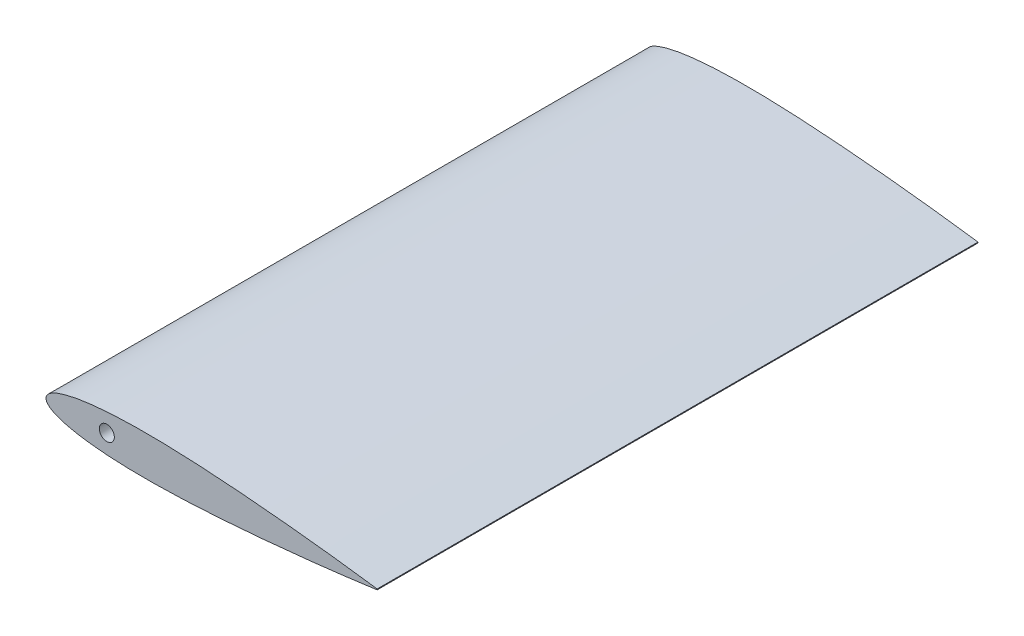
ISO-10303-21;
HEADER;
FILE_DESCRIPTION(('STEP AP214'),'2;1');
FILE_NAME('part.step','',(''),(''),'','','');
FILE_SCHEMA(('AUTOMOTIVE_DESIGN { 1 0 10303 214 1 1 1 1 }'));
ENDSEC;
DATA;
#1=APPLICATION_CONTEXT('core data for automotive mechanical design processes');
#2=APPLICATION_PROTOCOL_DEFINITION('international standard','automotive_design',2000,#1);
#3=PRODUCT_CONTEXT('',#1,'mechanical');
#4=PRODUCT('Part','Part','',(#3));
#5=PRODUCT_RELATED_PRODUCT_CATEGORY('part','',(#4));
#6=PRODUCT_DEFINITION_FORMATION('','',#4);
#7=PRODUCT_DEFINITION_CONTEXT('part definition',#1,'design');
#8=PRODUCT_DEFINITION('design','',#6,#7);
#9=PRODUCT_DEFINITION_SHAPE('','',#8);
#10=(LENGTH_UNIT() NAMED_UNIT(*) SI_UNIT(.MILLI.,.METRE.));
#11=(NAMED_UNIT(*) PLANE_ANGLE_UNIT() SI_UNIT($,.RADIAN.));
#12=(NAMED_UNIT(*) SI_UNIT($,.STERADIAN.) SOLID_ANGLE_UNIT());
#13=UNCERTAINTY_MEASURE_WITH_UNIT(LENGTH_MEASURE(1.E-05),#10,'distance_accuracy_value','');
#14=(GEOMETRIC_REPRESENTATION_CONTEXT(3) GLOBAL_UNCERTAINTY_ASSIGNED_CONTEXT((#13)) GLOBAL_UNIT_ASSIGNED_CONTEXT((#10,
#11,#12)) REPRESENTATION_CONTEXT('',''));
#15=CARTESIAN_POINT('',(0.,0.,0.));
#16=DIRECTION('',(0.,0.,1.));
#17=DIRECTION('',(1.,0.,0.));
#18=AXIS2_PLACEMENT_3D('',#15,#16,#17);
#19=CARTESIAN_POINT('',(0.999999999999996,0.00655199999999999,80.));
#20=CARTESIAN_POINT('',(0.158660800544209,0.124727464505664,80.));
#21=CARTESIAN_POINT('',(-3.01160477820115,0.553296946559793,80.));
#22=CARTESIAN_POINT('',(-7.42629613073326,1.07865066421757,80.));
#23=CARTESIAN_POINT('',(-12.6989847286214,1.62228087164357,80.));
#24=CARTESIAN_POINT('',(-16.6969543968295,1.9793098786306,80.));
#25=CARTESIAN_POINT('',(-20.519318828305,2.25952647948169,80.));
#26=CARTESIAN_POINT('',(-23.687785093306,2.44374322010374,80.));
#27=CARTESIAN_POINT('',(-26.8011874978675,2.56579063005801,80.));
#28=CARTESIAN_POINT('',(-29.7943879085281,2.61217218642654,80.));
#29=CARTESIAN_POINT('',(-32.327162108777,2.57644620248936,80.));
#30=CARTESIAN_POINT('',(-34.3977443969902,2.48251242056565,80.));
#31=CARTESIAN_POINT('',(-36.0221136643112,2.36180268040324,80.));
#32=CARTESIAN_POINT('',(-37.5070306516532,2.20055344267324,80.));
#33=CARTESIAN_POINT('',(-38.6490220389763,2.02971693212924,80.));
#34=CARTESIAN_POINT('',(-39.4814995926493,1.87202293598923,80.));
#35=CARTESIAN_POINT('',(-40.0437130245161,1.74890812485958,80.));
#36=CARTESIAN_POINT('',(-40.5616483454275,1.61773302438882,80.));
#37=CARTESIAN_POINT('',(-41.0341610798373,1.47908527731052,80.));
#38=CARTESIAN_POINT('',(-41.460209337935,1.333425332228,80.));
#39=CARTESIAN_POINT('',(-41.8388845485747,1.1812562663525,80.));
#40=CARTESIAN_POINT('',(-42.1694371067929,1.02301705882845,80.));
#41=CARTESIAN_POINT('',(-42.4512372669512,0.85903715601091,80.));
#42=CARTESIAN_POINT('',(-42.6839568844418,0.689594535943709,80.));
#43=CARTESIAN_POINT('',(-42.8671462818745,0.514410475149096,80.));
#44=CARTESIAN_POINT('',(-43.0003636929218,0.33298870624305,80.));
#45=CARTESIAN_POINT('',(-43.0818130281994,0.144442461015171,80.));
#46=CARTESIAN_POINT('',(-43.1088650915865,-0.0490140000000005,80.));
#47=CARTESIAN_POINT('',(-43.0818130281994,-0.242470461015168,80.));
#48=CARTESIAN_POINT('',(-43.0003636929218,-0.431016706243057,80.));
#49=CARTESIAN_POINT('',(-42.8671462818745,-0.612438475149088,80.));
#50=CARTESIAN_POINT('',(-42.6839568844417,-0.78762253594372,80.));
#51=CARTESIAN_POINT('',(-42.4512372669512,-0.957065156010903,80.));
#52=CARTESIAN_POINT('',(-42.1694371067929,-1.12104505882845,80.));
#53=CARTESIAN_POINT('',(-41.8388845485747,-1.27928426635251,80.));
#54=CARTESIAN_POINT('',(-41.460209337935,-1.431453332228,80.));
#55=CARTESIAN_POINT('',(-41.0341610798373,-1.57711327731051,80.));
#56=CARTESIAN_POINT('',(-40.5616483454274,-1.71576102438882,80.));
#57=CARTESIAN_POINT('',(-40.0437130245161,-1.84693612485958,80.));
#58=CARTESIAN_POINT('',(-39.2679764517944,-2.01680873234935,80.));
#59=CARTESIAN_POINT('',(-38.1928815280536,-2.20362122609191,80.));
#60=CARTESIAN_POINT('',(-36.7828819853804,-2.38409904717188,80.));
#61=CARTESIAN_POINT('',(-34.930256603947,-2.55220946420401,80.));
#62=CARTESIAN_POINT('',(-32.6047337447786,-2.67043877326897,80.));
#63=CARTESIAN_POINT('',(-29.4493170156146,-2.71507555523226,80.));
#64=CARTESIAN_POINT('',(-26.102193864567,-2.64586053183191,80.));
#65=CARTESIAN_POINT('',(-22.6344907977997,-2.48654980767847,80.));
#66=CARTESIAN_POINT('',(-19.462407721225,-2.28488075424879,80.));
#67=CARTESIAN_POINT('',(-15.9942687131869,-2.01563067272241,80.));
#68=CARTESIAN_POINT('',(-12.9552745963733,-1.73932108574648,80.));
#69=CARTESIAN_POINT('',(-9.03856357675308,-1.34663289915012,80.));
#70=CARTESIAN_POINT('',(-5.16468964287893,-0.913391579887053,80.));
#71=CARTESIAN_POINT('',(-1.46648618849793,-0.44361153852836,80.));
#72=CARTESIAN_POINT('',(0.380454214525049,-0.191304710540328,80.));
#73=CARTESIAN_POINT('',(0.922875158985858,-0.115413043221652,80.));
#74=CARTESIAN_POINT('',(0.999999999999996,-0.10458,80.));
#75=B_SPLINE_CURVE_WITH_KNOTS('',3,(#19,#20,#21,#22,#23,#24,#25,#26,#27,#28,#29,#30,#31,#32,#33,
#34,#35,#36,#37,#38,#39,#40,#41,#42,#43,#44,#45,#46,#47,#48,#49,#50,#51,#52,#53,#54,#55,#56,#57,
#58,#59,#60,#61,#62,#63,#64,#65,#66,#67,#68,#69,#70,#71,#72,#73,#74),.UNSPECIFIED.,.F.,.F.,(4,1,
1,1,1,1,1,1,1,1,1,1,1,1,1,1,1,1,1,1,1,1,1,1,1,1,1,1,1,1,1,1,1,1,1,1,1,1,1,1,1,1,1,1,1,1,1,1,1,1,
1,1,1,4),(0.,0.0283429008690872,0.106722048517726,0.148306054540842,0.205171366742429,
0.240621400483931,0.276160573352716,0.311047092160121,0.344559265520828,0.376017570419826,
0.395537658905913,0.413698812078543,0.430349273099823,0.445356904422305,0.452209372098903,
0.458611567079498,0.46455404405062,0.470029850192537,0.475034902370301,0.479569141493347,
0.483636857140142,0.487250262770083,0.490431337960153,0.493218828079602,0.495674085869199,
0.497891368316545,0.5,0.502108631683455,0.504325914130801,0.506781171920398,0.509568662039847,
0.512749737229918,0.516363142859858,0.520430858506654,0.524965097629699,0.529970149807464,
0.53544595594938,0.541388432920502,0.547790627901097,0.561933980705176,0.577778558712574,
0.595202023801781,0.623982429580175,0.655440734479173,0.700464146399425,0.735649712925285,
0.771241831243212,0.806495956538878,0.851693945459158,0.873039495246583,0.937813387298575,
0.981728387914688,0.997401830647112,1.),.UNSPECIFIED.);
#76=DIRECTION('',(0.,0.,-1.));
#77=VECTOR('',#76,1.);
#78=SURFACE_OF_LINEAR_EXTRUSION('',#75,#77);
#79=CARTESIAN_POINT('',(0.999999999999996,0.00655199999999999,0.));
#80=CARTESIAN_POINT('',(0.158660800544209,0.124727464505664,0.));
#81=CARTESIAN_POINT('',(-3.01160477820115,0.553296946559793,0.));
#82=CARTESIAN_POINT('',(-7.42629613073326,1.07865066421757,0.));
#83=CARTESIAN_POINT('',(-12.6989847286214,1.62228087164357,0.));
#84=CARTESIAN_POINT('',(-16.6969543968295,1.9793098786306,0.));
#85=CARTESIAN_POINT('',(-20.519318828305,2.25952647948169,0.));
#86=CARTESIAN_POINT('',(-23.687785093306,2.44374322010374,0.));
#87=CARTESIAN_POINT('',(-26.8011874978675,2.56579063005801,0.));
#88=CARTESIAN_POINT('',(-29.7943879085281,2.61217218642654,0.));
#89=CARTESIAN_POINT('',(-32.327162108777,2.57644620248936,0.));
#90=CARTESIAN_POINT('',(-34.3977443969902,2.48251242056565,0.));
#91=CARTESIAN_POINT('',(-36.0221136643112,2.36180268040324,0.));
#92=CARTESIAN_POINT('',(-37.5070306516532,2.20055344267324,0.));
#93=CARTESIAN_POINT('',(-38.6490220389763,2.02971693212924,0.));
#94=CARTESIAN_POINT('',(-39.4814995926493,1.87202293598923,0.));
#95=CARTESIAN_POINT('',(-40.0437130245161,1.74890812485958,0.));
#96=CARTESIAN_POINT('',(-40.5616483454275,1.61773302438882,0.));
#97=CARTESIAN_POINT('',(-41.0341610798373,1.47908527731052,0.));
#98=CARTESIAN_POINT('',(-41.460209337935,1.333425332228,0.));
#99=CARTESIAN_POINT('',(-41.8388845485747,1.1812562663525,0.));
#100=CARTESIAN_POINT('',(-42.1694371067929,1.02301705882845,0.));
#101=CARTESIAN_POINT('',(-42.4512372669512,0.85903715601091,0.));
#102=CARTESIAN_POINT('',(-42.6839568844418,0.689594535943709,0.));
#103=CARTESIAN_POINT('',(-42.8671462818745,0.514410475149096,0.));
#104=CARTESIAN_POINT('',(-43.0003636929218,0.33298870624305,0.));
#105=CARTESIAN_POINT('',(-43.0818130281994,0.144442461015171,0.));
#106=CARTESIAN_POINT('',(-43.1088650915865,-0.0490140000000005,0.));
#107=CARTESIAN_POINT('',(-43.0818130281994,-0.242470461015168,0.));
#108=CARTESIAN_POINT('',(-43.0003636929218,-0.431016706243057,0.));
#109=CARTESIAN_POINT('',(-42.8671462818745,-0.612438475149088,0.));
#110=CARTESIAN_POINT('',(-42.6839568844417,-0.78762253594372,0.));
#111=CARTESIAN_POINT('',(-42.4512372669512,-0.957065156010903,0.));
#112=CARTESIAN_POINT('',(-42.1694371067929,-1.12104505882845,0.));
#113=CARTESIAN_POINT('',(-41.8388845485747,-1.27928426635251,0.));
#114=CARTESIAN_POINT('',(-41.460209337935,-1.431453332228,0.));
#115=CARTESIAN_POINT('',(-41.0341610798373,-1.57711327731051,0.));
#116=CARTESIAN_POINT('',(-40.5616483454274,-1.71576102438882,0.));
#117=CARTESIAN_POINT('',(-40.0437130245161,-1.84693612485958,0.));
#118=CARTESIAN_POINT('',(-39.2679764517944,-2.01680873234935,0.));
#119=CARTESIAN_POINT('',(-38.1928815280536,-2.20362122609191,0.));
#120=CARTESIAN_POINT('',(-36.7828819853804,-2.38409904717188,0.));
#121=CARTESIAN_POINT('',(-34.930256603947,-2.55220946420401,0.));
#122=CARTESIAN_POINT('',(-32.6047337447786,-2.67043877326897,0.));
#123=CARTESIAN_POINT('',(-29.4493170156146,-2.71507555523226,0.));
#124=CARTESIAN_POINT('',(-26.102193864567,-2.64586053183191,0.));
#125=CARTESIAN_POINT('',(-22.6344907977997,-2.48654980767847,0.));
#126=CARTESIAN_POINT('',(-19.462407721225,-2.28488075424879,0.));
#127=CARTESIAN_POINT('',(-15.9942687131869,-2.01563067272241,0.));
#128=CARTESIAN_POINT('',(-12.9552745963733,-1.73932108574648,0.));
#129=CARTESIAN_POINT('',(-9.03856357675308,-1.34663289915012,0.));
#130=CARTESIAN_POINT('',(-5.16468964287893,-0.913391579887053,0.));
#131=CARTESIAN_POINT('',(-1.46648618849793,-0.44361153852836,0.));
#132=CARTESIAN_POINT('',(0.380454214525049,-0.191304710540328,0.));
#133=CARTESIAN_POINT('',(0.922875158985858,-0.115413043221652,0.));
#134=CARTESIAN_POINT('',(0.999999999999996,-0.10458,0.));
#135=B_SPLINE_CURVE_WITH_KNOTS('',3,(#79,#80,#81,#82,#83,#84,#85,#86,#87,#88,#89,#90,#91,#92,
#93,#94,#95,#96,#97,#98,#99,#100,#101,#102,#103,#104,#105,#106,#107,#108,#109,#110,#111,#112,
#113,#114,#115,#116,#117,#118,#119,#120,#121,#122,#123,#124,#125,#126,#127,#128,#129,#130,#131,
#132,#133,#134),.UNSPECIFIED.,.F.,.F.,(4,1,1,1,1,1,1,1,1,1,1,1,1,1,1,1,1,1,1,1,1,1,1,1,1,1,1,1,
1,1,1,1,1,1,1,1,1,1,1,1,1,1,1,1,1,1,1,1,1,1,1,1,1,4),(0.,0.0283429008690872,0.106722048517726,
0.148306054540842,0.205171366742429,0.240621400483931,0.276160573352716,0.311047092160121,
0.344559265520828,0.376017570419826,0.395537658905913,0.413698812078543,0.430349273099823,
0.445356904422305,0.452209372098903,0.458611567079498,0.46455404405062,0.470029850192537,
0.475034902370301,0.479569141493347,0.483636857140142,0.487250262770083,0.490431337960153,
0.493218828079602,0.495674085869199,0.497891368316545,0.5,0.502108631683455,0.504325914130801,
0.506781171920398,0.509568662039847,0.512749737229918,0.516363142859858,0.520430858506654,
0.524965097629699,0.529970149807464,0.53544595594938,0.541388432920502,0.547790627901097,
0.561933980705176,0.577778558712574,0.595202023801781,0.623982429580175,0.655440734479173,
0.700464146399425,0.735649712925285,0.771241831243212,0.806495956538878,0.851693945459158,
0.873039495246583,0.937813387298575,0.981728387914688,0.997401830647112,1.),.UNSPECIFIED.);
#136=CARTESIAN_POINT('',(0.999999999999996,0.00655199999999999,0.));
#137=VERTEX_POINT('',#136);
#138=CARTESIAN_POINT('',(0.999999999999996,-0.10458,0.));
#139=VERTEX_POINT('',#138);
#140=EDGE_CURVE('E65',#137,#139,#135,.T.);
#141=ORIENTED_EDGE('',*,*,#140,.T.);
#142=DIRECTION('',(0.,0.,-1.));
#143=VECTOR('',#142,1.);
#144=CARTESIAN_POINT('',(0.999999999999996,-0.10458,80.));
#145=LINE('',#144,#143);
#146=CARTESIAN_POINT('',(0.999999999999996,-0.10458,80.));
#147=VERTEX_POINT('',#146);
#148=EDGE_CURVE('E11',#147,#139,#145,.T.);
#149=ORIENTED_EDGE('',*,*,#148,.F.);
#150=CARTESIAN_POINT('',(0.999999999999996,0.00655199999999999,80.));
#151=VERTEX_POINT('',#150);
#152=EDGE_CURVE('E64',#151,#147,#75,.T.);
#153=ORIENTED_EDGE('',*,*,#152,.F.);
#154=DIRECTION('',(0.,0.,-1.));
#155=VECTOR('',#154,1.);
#156=CARTESIAN_POINT('',(0.999999999999996,0.00655199999999999,80.));
#157=LINE('',#156,#155);
#158=EDGE_CURVE('E42',#151,#137,#157,.T.);
#159=ORIENTED_EDGE('',*,*,#158,.T.);
#160=EDGE_LOOP('',(#141,#149,#153,#159));
#161=FACE_BOUND('',#160,.T.);
#162=ADVANCED_FACE('F33',(#161),#78,.F.);
#163=CARTESIAN_POINT('',(0.999999999999996,-0.10458,80.));
#164=DIRECTION('',(-1.,0.,0.));
#165=DIRECTION('',(0.,0.,1.));
#166=AXIS2_PLACEMENT_3D('',#163,#164,#165);
#167=PLANE('',#166);
#168=DIRECTION('',(0.,1.,0.));
#169=VECTOR('',#168,1.);
#170=CARTESIAN_POINT('',(0.999999999999996,-0.10458,0.));
#171=LINE('',#170,#169);
#172=EDGE_CURVE('E57',#139,#137,#171,.T.);
#173=ORIENTED_EDGE('',*,*,#172,.T.);
#174=ORIENTED_EDGE('',*,*,#158,.F.);
#175=DIRECTION('',(0.,1.,0.));
#176=VECTOR('',#175,1.);
#177=CARTESIAN_POINT('',(0.999999999999996,-0.10458,80.));
#178=LINE('',#177,#176);
#179=EDGE_CURVE('E49',#147,#151,#178,.T.);
#180=ORIENTED_EDGE('',*,*,#179,.F.);
#181=ORIENTED_EDGE('',*,*,#148,.T.);
#182=EDGE_LOOP('',(#173,#174,#180,#181));
#183=FACE_BOUND('',#182,.T.);
#184=ADVANCED_FACE('F60',(#183),#167,.F.);
#185=CARTESIAN_POINT('',(-43.1,-0.04901399999999,80.));
#186=DIRECTION('',(0.,0.,-1.));
#187=DIRECTION('',(-1.,0.,0.));
#188=AXIS2_PLACEMENT_3D('',#185,#186,#187);
#189=PLANE('',#188);
#190=CARTESIAN_POINT('',(-35.,0.,80.));
#191=DIRECTION('',(0.,0.,1.));
#192=DIRECTION('',(1.,0.,0.));
#193=AXIS2_PLACEMENT_3D('',#190,#191,#192);
#194=CIRCLE('',#193,0.999999999999998);
#195=CARTESIAN_POINT('',(-34.,0.,80.));
#196=VERTEX_POINT('',#195);
#197=EDGE_CURVE('E72',#196,#196,#194,.T.);
#198=ORIENTED_EDGE('',*,*,#197,.F.);
#199=EDGE_LOOP('',(#198));
#200=FACE_BOUND('',#199,.T.);
#201=ORIENTED_EDGE('',*,*,#152,.T.);
#202=ORIENTED_EDGE('',*,*,#179,.T.);
#203=EDGE_LOOP('',(#201,#202));
#204=FACE_BOUND('',#203,.T.);
#205=ADVANCED_FACE('F92',(#200,#204),#189,.F.);
#206=CARTESIAN_POINT('',(-43.1,-0.04901399999999,0.));
#207=DIRECTION('',(0.,0.,-1.));
#208=DIRECTION('',(-1.,0.,0.));
#209=AXIS2_PLACEMENT_3D('',#206,#207,#208);
#210=PLANE('',#209);
#211=CARTESIAN_POINT('',(-35.,0.,0.));
#212=DIRECTION('',(0.,0.,1.));
#213=DIRECTION('',(1.,0.,0.));
#214=AXIS2_PLACEMENT_3D('',#211,#212,#213);
#215=CIRCLE('',#214,0.999999999999998);
#216=CARTESIAN_POINT('',(-34.,0.,0.));
#217=VERTEX_POINT('',#216);
#218=EDGE_CURVE('E69',#217,#217,#215,.T.);
#219=ORIENTED_EDGE('',*,*,#218,.T.);
#220=EDGE_LOOP('',(#219));
#221=FACE_BOUND('',#220,.T.);
#222=ORIENTED_EDGE('',*,*,#140,.F.);
#223=ORIENTED_EDGE('',*,*,#172,.F.);
#224=EDGE_LOOP('',(#222,#223));
#225=FACE_BOUND('',#224,.T.);
#226=ADVANCED_FACE('F68',(#221,#225),#210,.T.);
#227=CARTESIAN_POINT('',(-35.,0.,0.));
#228=DIRECTION('',(0.,0.,1.));
#229=DIRECTION('',(1.,0.,0.));
#230=AXIS2_PLACEMENT_3D('',#227,#228,#229);
#231=CYLINDRICAL_SURFACE('',#230,0.999999999999998);
#232=ORIENTED_EDGE('',*,*,#218,.F.);
#233=EDGE_LOOP('',(#232));
#234=FACE_BOUND('',#233,.T.);
#235=ORIENTED_EDGE('',*,*,#197,.T.);
#236=EDGE_LOOP('',(#235));
#237=FACE_BOUND('',#236,.T.);
#238=ADVANCED_FACE('F90',(#234,#237),#231,.F.);
#239=CLOSED_SHELL('',(#162,#184,#205,#226,#238));
#240=MANIFOLD_SOLID_BREP('B2',#239);
#241=ADVANCED_BREP_SHAPE_REPRESENTATION('',(#18,#240),#14);
#242=SHAPE_DEFINITION_REPRESENTATION(#9,#241);
ENDSEC;
END-ISO-10303-21;
